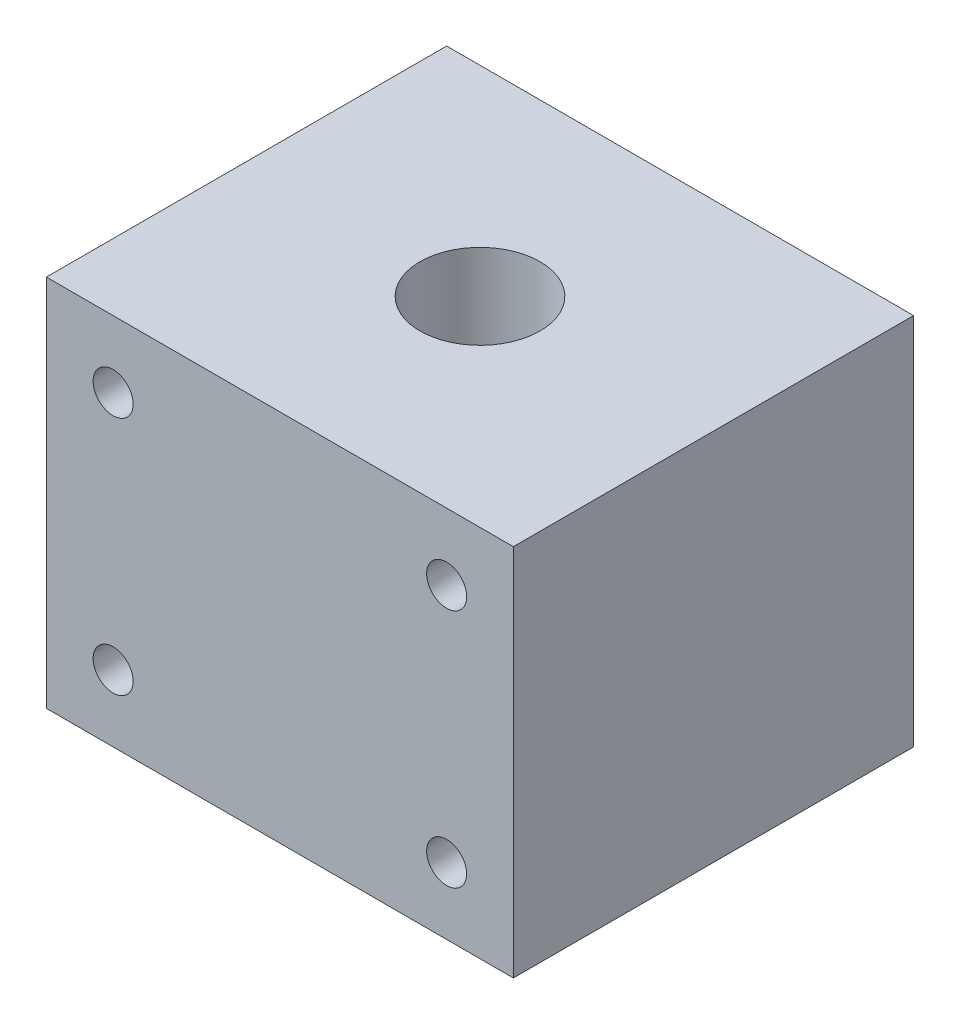
ISO-10303-21;
HEADER;
FILE_DESCRIPTION(('STEP AP214'),'2;1');
FILE_NAME('part.step','',(''),(''),'','','');
FILE_SCHEMA(('AUTOMOTIVE_DESIGN { 1 0 10303 214 1 1 1 1 }'));
ENDSEC;
DATA;
#1=APPLICATION_CONTEXT('core data for automotive mechanical design processes');
#2=APPLICATION_PROTOCOL_DEFINITION('international standard','automotive_design',2000,#1);
#3=PRODUCT_CONTEXT('',#1,'mechanical');
#4=PRODUCT('Part','Part','',(#3));
#5=PRODUCT_RELATED_PRODUCT_CATEGORY('part','',(#4));
#6=PRODUCT_DEFINITION_FORMATION('','',#4);
#7=PRODUCT_DEFINITION_CONTEXT('part definition',#1,'design');
#8=PRODUCT_DEFINITION('design','',#6,#7);
#9=PRODUCT_DEFINITION_SHAPE('','',#8);
#10=(LENGTH_UNIT() NAMED_UNIT(*) SI_UNIT(.MILLI.,.METRE.));
#11=(NAMED_UNIT(*) PLANE_ANGLE_UNIT() SI_UNIT($,.RADIAN.));
#12=(NAMED_UNIT(*) SI_UNIT($,.STERADIAN.) SOLID_ANGLE_UNIT());
#13=UNCERTAINTY_MEASURE_WITH_UNIT(LENGTH_MEASURE(1.E-05),#10,'distance_accuracy_value','');
#14=(GEOMETRIC_REPRESENTATION_CONTEXT(3) GLOBAL_UNCERTAINTY_ASSIGNED_CONTEXT((#13)) GLOBAL_UNIT_ASSIGNED_CONTEXT((#10,
#11,#12)) REPRESENTATION_CONTEXT('',''));
#15=CARTESIAN_POINT('',(0.,0.,0.));
#16=DIRECTION('',(0.,0.,1.));
#17=DIRECTION('',(1.,0.,0.));
#18=AXIS2_PLACEMENT_3D('',#15,#16,#17);
#19=CARTESIAN_POINT('',(17.5,28.,15.));
#20=DIRECTION('',(-1.,0.,0.));
#21=DIRECTION('',(0.,0.,1.));
#22=AXIS2_PLACEMENT_3D('',#19,#20,#21);
#23=PLANE('',#22);
#24=DIRECTION('',(0.,0.,-1.));
#25=VECTOR('',#24,1.);
#26=CARTESIAN_POINT('',(17.5,0.,15.));
#27=LINE('',#26,#25);
#28=CARTESIAN_POINT('',(17.5,0.,15.));
#29=VERTEX_POINT('',#28);
#30=CARTESIAN_POINT('',(17.5,0.,-15.));
#31=VERTEX_POINT('',#30);
#32=EDGE_CURVE('E102',#29,#31,#27,.T.);
#33=ORIENTED_EDGE('',*,*,#32,.T.);
#34=DIRECTION('',(0.,-1.,0.));
#35=VECTOR('',#34,1.);
#36=CARTESIAN_POINT('',(17.5,28.,-15.));
#37=LINE('',#36,#35);
#38=CARTESIAN_POINT('',(17.5,28.,-15.));
#39=VERTEX_POINT('',#38);
#40=EDGE_CURVE('E11',#39,#31,#37,.T.);
#41=ORIENTED_EDGE('',*,*,#40,.F.);
#42=DIRECTION('',(0.,0.,-1.));
#43=VECTOR('',#42,1.);
#44=CARTESIAN_POINT('',(17.5,28.,15.));
#45=LINE('',#44,#43);
#46=CARTESIAN_POINT('',(17.5,28.,15.));
#47=VERTEX_POINT('',#46);
#48=EDGE_CURVE('E89',#47,#39,#45,.T.);
#49=ORIENTED_EDGE('',*,*,#48,.F.);
#50=DIRECTION('',(0.,-1.,0.));
#51=VECTOR('',#50,1.);
#52=CARTESIAN_POINT('',(17.5,28.,15.));
#53=LINE('',#52,#51);
#54=EDGE_CURVE('E98',#47,#29,#53,.T.);
#55=ORIENTED_EDGE('',*,*,#54,.T.);
#56=EDGE_LOOP('',(#33,#41,#49,#55));
#57=FACE_BOUND('',#56,.T.);
#58=ADVANCED_FACE('F37',(#57),#23,.F.);
#59=CARTESIAN_POINT('',(-17.5,28.,-15.));
#60=DIRECTION('',(0.,0.,1.));
#61=DIRECTION('',(1.,0.,0.));
#62=AXIS2_PLACEMENT_3D('',#59,#60,#61);
#63=PLANE('',#62);
#64=DIRECTION('',(-1.,0.,0.));
#65=VECTOR('',#64,1.);
#66=CARTESIAN_POINT('',(-17.5,0.,-15.));
#67=LINE('',#66,#65);
#68=CARTESIAN_POINT('',(-17.5,0.,-15.));
#69=VERTEX_POINT('',#68);
#70=EDGE_CURVE('E93',#31,#69,#67,.T.);
#71=ORIENTED_EDGE('',*,*,#70,.T.);
#72=DIRECTION('',(0.,-1.,0.));
#73=VECTOR('',#72,1.);
#74=CARTESIAN_POINT('',(-17.5,28.,-15.));
#75=LINE('',#74,#73);
#76=CARTESIAN_POINT('',(-17.5,28.,-15.));
#77=VERTEX_POINT('',#76);
#78=EDGE_CURVE('E46',#77,#69,#75,.T.);
#79=ORIENTED_EDGE('',*,*,#78,.F.);
#80=DIRECTION('',(-1.,0.,0.));
#81=VECTOR('',#80,1.);
#82=CARTESIAN_POINT('',(-17.5,28.,-15.));
#83=LINE('',#82,#81);
#84=EDGE_CURVE('E84',#39,#77,#83,.T.);
#85=ORIENTED_EDGE('',*,*,#84,.F.);
#86=ORIENTED_EDGE('',*,*,#40,.T.);
#87=EDGE_LOOP('',(#71,#79,#85,#86));
#88=FACE_BOUND('',#87,.T.);
#89=ADVANCED_FACE('F92',(#88),#63,.F.);
#90=CARTESIAN_POINT('',(-17.5,28.,15.));
#91=DIRECTION('',(1.,0.,0.));
#92=DIRECTION('',(0.,0.,-1.));
#93=AXIS2_PLACEMENT_3D('',#90,#91,#92);
#94=PLANE('',#93);
#95=DIRECTION('',(0.,0.,1.));
#96=VECTOR('',#95,1.);
#97=CARTESIAN_POINT('',(-17.5,0.,15.));
#98=LINE('',#97,#96);
#99=CARTESIAN_POINT('',(-17.5,0.,15.));
#100=VERTEX_POINT('',#99);
#101=EDGE_CURVE('E71',#69,#100,#98,.T.);
#102=ORIENTED_EDGE('',*,*,#101,.T.);
#103=DIRECTION('',(0.,-1.,0.));
#104=VECTOR('',#103,1.);
#105=CARTESIAN_POINT('',(-17.5,28.,15.));
#106=LINE('',#105,#104);
#107=CARTESIAN_POINT('',(-17.5,28.,15.));
#108=VERTEX_POINT('',#107);
#109=EDGE_CURVE('E94',#108,#100,#106,.T.);
#110=ORIENTED_EDGE('',*,*,#109,.F.);
#111=DIRECTION('',(0.,0.,1.));
#112=VECTOR('',#111,1.);
#113=CARTESIAN_POINT('',(-17.5,28.,15.));
#114=LINE('',#113,#112);
#115=EDGE_CURVE('E87',#77,#108,#114,.T.);
#116=ORIENTED_EDGE('',*,*,#115,.F.);
#117=ORIENTED_EDGE('',*,*,#78,.T.);
#118=EDGE_LOOP('',(#102,#110,#116,#117));
#119=FACE_BOUND('',#118,.T.);
#120=ADVANCED_FACE('F96',(#119),#94,.F.);
#121=CARTESIAN_POINT('',(-17.5,28.,15.));
#122=DIRECTION('',(0.,0.,-1.));
#123=DIRECTION('',(-1.,0.,0.));
#124=AXIS2_PLACEMENT_3D('',#121,#122,#123);
#125=PLANE('',#124);
#126=CARTESIAN_POINT('',(-12.5,5.,15.));
#127=DIRECTION('',(0.,0.,1.));
#128=DIRECTION('',(1.,0.,0.));
#129=AXIS2_PLACEMENT_3D('',#126,#127,#128);
#130=CIRCLE('',#129,1.5);
#131=CARTESIAN_POINT('',(-11.,5.,15.));
#132=VERTEX_POINT('',#131);
#133=EDGE_CURVE('E122',#132,#132,#130,.T.);
#134=ORIENTED_EDGE('',*,*,#133,.F.);
#135=EDGE_LOOP('',(#134));
#136=FACE_BOUND('',#135,.T.);
#137=CARTESIAN_POINT('',(12.5,5.,15.));
#138=DIRECTION('',(0.,0.,1.));
#139=DIRECTION('',(1.,0.,0.));
#140=AXIS2_PLACEMENT_3D('',#137,#138,#139);
#141=CIRCLE('',#140,1.5);
#142=CARTESIAN_POINT('',(14.,5.,15.));
#143=VERTEX_POINT('',#142);
#144=EDGE_CURVE('E129',#143,#143,#141,.T.);
#145=ORIENTED_EDGE('',*,*,#144,.F.);
#146=EDGE_LOOP('',(#145));
#147=FACE_BOUND('',#146,.T.);
#148=CARTESIAN_POINT('',(12.5,23.,15.));
#149=DIRECTION('',(0.,0.,1.));
#150=DIRECTION('',(1.,0.,0.));
#151=AXIS2_PLACEMENT_3D('',#148,#149,#150);
#152=CIRCLE('',#151,1.5);
#153=CARTESIAN_POINT('',(14.,23.,15.));
#154=VERTEX_POINT('',#153);
#155=EDGE_CURVE('E135',#154,#154,#152,.T.);
#156=ORIENTED_EDGE('',*,*,#155,.F.);
#157=EDGE_LOOP('',(#156));
#158=FACE_BOUND('',#157,.T.);
#159=CARTESIAN_POINT('',(-12.5,23.,15.));
#160=DIRECTION('',(0.,0.,1.));
#161=DIRECTION('',(1.,0.,0.));
#162=AXIS2_PLACEMENT_3D('',#159,#160,#161);
#163=CIRCLE('',#162,1.5);
#164=CARTESIAN_POINT('',(-11.,23.,15.));
#165=VERTEX_POINT('',#164);
#166=EDGE_CURVE('E116',#165,#165,#163,.T.);
#167=ORIENTED_EDGE('',*,*,#166,.F.);
#168=EDGE_LOOP('',(#167));
#169=FACE_BOUND('',#168,.T.);
#170=DIRECTION('',(1.,0.,0.));
#171=VECTOR('',#170,1.);
#172=CARTESIAN_POINT('',(-17.5,0.,15.));
#173=LINE('',#172,#171);
#174=EDGE_CURVE('E77',#100,#29,#173,.T.);
#175=ORIENTED_EDGE('',*,*,#174,.T.);
#176=ORIENTED_EDGE('',*,*,#54,.F.);
#177=DIRECTION('',(1.,0.,0.));
#178=VECTOR('',#177,1.);
#179=CARTESIAN_POINT('',(-17.5,28.,15.));
#180=LINE('',#179,#178);
#181=EDGE_CURVE('E54',#108,#47,#180,.T.);
#182=ORIENTED_EDGE('',*,*,#181,.F.);
#183=ORIENTED_EDGE('',*,*,#109,.T.);
#184=EDGE_LOOP('',(#175,#176,#182,#183));
#185=FACE_BOUND('',#184,.T.);
#186=ADVANCED_FACE('F110',(#136,#147,#158,#169,#185),#125,.F.);
#187=CARTESIAN_POINT('',(0.,28.,0.));
#188=DIRECTION('',(0.,-1.,0.));
#189=DIRECTION('',(0.,0.,-1.));
#190=AXIS2_PLACEMENT_3D('',#187,#188,#189);
#191=PLANE('',#190);
#192=CARTESIAN_POINT('',(0.,28.,0.));
#193=DIRECTION('',(0.,-1.,0.));
#194=DIRECTION('',(0.,0.,-1.));
#195=AXIS2_PLACEMENT_3D('',#192,#193,#194);
#196=CIRCLE('',#195,4.5);
#197=CARTESIAN_POINT('',(0.,28.,-4.5));
#198=VERTEX_POINT('',#197);
#199=EDGE_CURVE('E145',#198,#198,#196,.T.);
#200=ORIENTED_EDGE('',*,*,#199,.T.);
#201=EDGE_LOOP('',(#200));
#202=FACE_BOUND('',#201,.T.);
#203=ORIENTED_EDGE('',*,*,#48,.T.);
#204=ORIENTED_EDGE('',*,*,#84,.T.);
#205=ORIENTED_EDGE('',*,*,#115,.T.);
#206=ORIENTED_EDGE('',*,*,#181,.T.);
#207=EDGE_LOOP('',(#203,#204,#205,#206));
#208=FACE_BOUND('',#207,.T.);
#209=ADVANCED_FACE('F85',(#202,#208),#191,.F.);
#210=CARTESIAN_POINT('',(0.,0.,0.));
#211=DIRECTION('',(0.,-1.,0.));
#212=DIRECTION('',(0.,0.,-1.));
#213=AXIS2_PLACEMENT_3D('',#210,#211,#212);
#214=PLANE('',#213);
#215=CARTESIAN_POINT('',(0.,0.,0.));
#216=DIRECTION('',(0.,-1.,0.));
#217=DIRECTION('',(0.,0.,-1.));
#218=AXIS2_PLACEMENT_3D('',#215,#216,#217);
#219=CIRCLE('',#218,11.5);
#220=CARTESIAN_POINT('',(0.,0.,-11.5));
#221=VERTEX_POINT('',#220);
#222=EDGE_CURVE('E140',#221,#221,#219,.T.);
#223=ORIENTED_EDGE('',*,*,#222,.F.);
#224=EDGE_LOOP('',(#223));
#225=FACE_BOUND('',#224,.T.);
#226=ORIENTED_EDGE('',*,*,#32,.F.);
#227=ORIENTED_EDGE('',*,*,#174,.F.);
#228=ORIENTED_EDGE('',*,*,#101,.F.);
#229=ORIENTED_EDGE('',*,*,#70,.F.);
#230=EDGE_LOOP('',(#226,#227,#228,#229));
#231=FACE_BOUND('',#230,.T.);
#232=ADVANCED_FACE('F113',(#225,#231),#214,.T.);
#233=CARTESIAN_POINT('',(-12.5,23.,5.));
#234=DIRECTION('',(0.,0.,1.));
#235=DIRECTION('',(1.,0.,0.));
#236=AXIS2_PLACEMENT_3D('',#233,#234,#235);
#237=CYLINDRICAL_SURFACE('',#236,1.5);
#238=CARTESIAN_POINT('',(-12.5,23.,5.));
#239=DIRECTION('',(0.,0.,1.));
#240=DIRECTION('',(1.,0.,0.));
#241=AXIS2_PLACEMENT_3D('',#238,#239,#240);
#242=CIRCLE('',#241,1.5);
#243=CARTESIAN_POINT('',(-11.,23.,5.));
#244=VERTEX_POINT('',#243);
#245=EDGE_CURVE('E105',#244,#244,#242,.T.);
#246=ORIENTED_EDGE('',*,*,#245,.F.);
#247=EDGE_LOOP('',(#246));
#248=FACE_BOUND('',#247,.T.);
#249=ORIENTED_EDGE('',*,*,#166,.T.);
#250=EDGE_LOOP('',(#249));
#251=FACE_BOUND('',#250,.T.);
#252=ADVANCED_FACE('F178',(#248,#251),#237,.F.);
#253=CARTESIAN_POINT('',(-12.5,23.,5.));
#254=DIRECTION('',(0.,0.,1.));
#255=DIRECTION('',(1.,0.,0.));
#256=AXIS2_PLACEMENT_3D('',#253,#254,#255);
#257=PLANE('',#256);
#258=ORIENTED_EDGE('',*,*,#245,.T.);
#259=EDGE_LOOP('',(#258));
#260=FACE_BOUND('',#259,.T.);
#261=ADVANCED_FACE('F184',(#260),#257,.T.);
#262=CARTESIAN_POINT('',(12.5,23.,5.));
#263=DIRECTION('',(0.,0.,1.));
#264=DIRECTION('',(1.,0.,0.));
#265=AXIS2_PLACEMENT_3D('',#262,#263,#264);
#266=CYLINDRICAL_SURFACE('',#265,1.5);
#267=CARTESIAN_POINT('',(12.5,23.,5.));
#268=DIRECTION('',(0.,0.,1.));
#269=DIRECTION('',(1.,0.,0.));
#270=AXIS2_PLACEMENT_3D('',#267,#268,#269);
#271=CIRCLE('',#270,1.5);
#272=CARTESIAN_POINT('',(14.,23.,5.));
#273=VERTEX_POINT('',#272);
#274=EDGE_CURVE('E119',#273,#273,#271,.T.);
#275=ORIENTED_EDGE('',*,*,#274,.F.);
#276=EDGE_LOOP('',(#275));
#277=FACE_BOUND('',#276,.T.);
#278=ORIENTED_EDGE('',*,*,#155,.T.);
#279=EDGE_LOOP('',(#278));
#280=FACE_BOUND('',#279,.T.);
#281=ADVANCED_FACE('F188',(#277,#280),#266,.F.);
#282=CARTESIAN_POINT('',(12.5,23.,5.));
#283=DIRECTION('',(0.,0.,1.));
#284=DIRECTION('',(1.,0.,0.));
#285=AXIS2_PLACEMENT_3D('',#282,#283,#284);
#286=PLANE('',#285);
#287=ORIENTED_EDGE('',*,*,#274,.T.);
#288=EDGE_LOOP('',(#287));
#289=FACE_BOUND('',#288,.T.);
#290=ADVANCED_FACE('F202',(#289),#286,.T.);
#291=CARTESIAN_POINT('',(12.5,5.,5.));
#292=DIRECTION('',(0.,0.,1.));
#293=DIRECTION('',(1.,0.,0.));
#294=AXIS2_PLACEMENT_3D('',#291,#292,#293);
#295=CYLINDRICAL_SURFACE('',#294,1.5);
#296=CARTESIAN_POINT('',(12.5,5.,5.));
#297=DIRECTION('',(0.,0.,1.));
#298=DIRECTION('',(1.,0.,0.));
#299=AXIS2_PLACEMENT_3D('',#296,#297,#298);
#300=CIRCLE('',#299,1.5);
#301=CARTESIAN_POINT('',(14.,5.,5.));
#302=VERTEX_POINT('',#301);
#303=EDGE_CURVE('E132',#302,#302,#300,.T.);
#304=ORIENTED_EDGE('',*,*,#303,.F.);
#305=EDGE_LOOP('',(#304));
#306=FACE_BOUND('',#305,.T.);
#307=ORIENTED_EDGE('',*,*,#144,.T.);
#308=EDGE_LOOP('',(#307));
#309=FACE_BOUND('',#308,.T.);
#310=ADVANCED_FACE('F199',(#306,#309),#295,.F.);
#311=CARTESIAN_POINT('',(12.5,5.,5.));
#312=DIRECTION('',(0.,0.,1.));
#313=DIRECTION('',(1.,0.,0.));
#314=AXIS2_PLACEMENT_3D('',#311,#312,#313);
#315=PLANE('',#314);
#316=ORIENTED_EDGE('',*,*,#303,.T.);
#317=EDGE_LOOP('',(#316));
#318=FACE_BOUND('',#317,.T.);
#319=ADVANCED_FACE('F194',(#318),#315,.T.);
#320=CARTESIAN_POINT('',(-12.5,5.,5.));
#321=DIRECTION('',(0.,0.,1.));
#322=DIRECTION('',(1.,0.,0.));
#323=AXIS2_PLACEMENT_3D('',#320,#321,#322);
#324=CYLINDRICAL_SURFACE('',#323,1.5);
#325=CARTESIAN_POINT('',(-12.5,5.,5.));
#326=DIRECTION('',(0.,0.,1.));
#327=DIRECTION('',(1.,0.,0.));
#328=AXIS2_PLACEMENT_3D('',#325,#326,#327);
#329=CIRCLE('',#328,1.5);
#330=CARTESIAN_POINT('',(-11.,5.,5.));
#331=VERTEX_POINT('',#330);
#332=EDGE_CURVE('E125',#331,#331,#329,.T.);
#333=ORIENTED_EDGE('',*,*,#332,.F.);
#334=EDGE_LOOP('',(#333));
#335=FACE_BOUND('',#334,.T.);
#336=ORIENTED_EDGE('',*,*,#133,.T.);
#337=EDGE_LOOP('',(#336));
#338=FACE_BOUND('',#337,.T.);
#339=ADVANCED_FACE('F190',(#335,#338),#324,.F.);
#340=CARTESIAN_POINT('',(-12.5,5.,5.));
#341=DIRECTION('',(0.,0.,1.));
#342=DIRECTION('',(1.,0.,0.));
#343=AXIS2_PLACEMENT_3D('',#340,#341,#342);
#344=PLANE('',#343);
#345=ORIENTED_EDGE('',*,*,#332,.T.);
#346=EDGE_LOOP('',(#345));
#347=FACE_BOUND('',#346,.T.);
#348=ADVANCED_FACE('F193',(#347),#344,.T.);
#349=CARTESIAN_POINT('',(0.,3.,0.));
#350=DIRECTION('',(0.,-1.,0.));
#351=DIRECTION('',(0.,0.,-1.));
#352=AXIS2_PLACEMENT_3D('',#349,#350,#351);
#353=CYLINDRICAL_SURFACE('',#352,11.5);
#354=CARTESIAN_POINT('',(0.,3.,0.));
#355=DIRECTION('',(0.,-1.,0.));
#356=DIRECTION('',(0.,0.,-1.));
#357=AXIS2_PLACEMENT_3D('',#354,#355,#356);
#358=CIRCLE('',#357,11.5);
#359=CARTESIAN_POINT('',(0.,3.,-11.5));
#360=VERTEX_POINT('',#359);
#361=EDGE_CURVE('E126',#360,#360,#358,.T.);
#362=ORIENTED_EDGE('',*,*,#361,.F.);
#363=EDGE_LOOP('',(#362));
#364=FACE_BOUND('',#363,.T.);
#365=ORIENTED_EDGE('',*,*,#222,.T.);
#366=EDGE_LOOP('',(#365));
#367=FACE_BOUND('',#366,.T.);
#368=ADVANCED_FACE('F162',(#364,#367),#353,.F.);
#369=CARTESIAN_POINT('',(0.,3.,0.));
#370=DIRECTION('',(0.,-1.,0.));
#371=DIRECTION('',(0.,0.,-1.));
#372=AXIS2_PLACEMENT_3D('',#369,#370,#371);
#373=PLANE('',#372);
#374=CARTESIAN_POINT('',(0.,3.,0.));
#375=DIRECTION('',(0.,-1.,0.));
#376=DIRECTION('',(0.,0.,-1.));
#377=AXIS2_PLACEMENT_3D('',#374,#375,#376);
#378=CIRCLE('',#377,4.5);
#379=CARTESIAN_POINT('',(0.,3.,-4.5));
#380=VERTEX_POINT('',#379);
#381=EDGE_CURVE('E40',#380,#380,#378,.F.);
#382=ORIENTED_EDGE('',*,*,#381,.T.);
#383=EDGE_LOOP('',(#382));
#384=FACE_BOUND('',#383,.T.);
#385=ORIENTED_EDGE('',*,*,#361,.T.);
#386=EDGE_LOOP('',(#385));
#387=FACE_BOUND('',#386,.T.);
#388=ADVANCED_FACE('F152',(#384,#387),#373,.T.);
#389=CARTESIAN_POINT('',(0.,0.,0.));
#390=DIRECTION('',(0.,1.,0.));
#391=DIRECTION('',(0.,0.,1.));
#392=AXIS2_PLACEMENT_3D('',#389,#390,#391);
#393=CYLINDRICAL_SURFACE('',#392,4.5);
#394=ORIENTED_EDGE('',*,*,#381,.F.);
#395=EDGE_LOOP('',(#394));
#396=FACE_BOUND('',#395,.T.);
#397=ORIENTED_EDGE('',*,*,#199,.F.);
#398=EDGE_LOOP('',(#397));
#399=FACE_BOUND('',#398,.T.);
#400=ADVANCED_FACE('F155',(#396,#399),#393,.F.);
#401=CLOSED_SHELL('',(#58,#89,#120,#186,#209,#232,#252,#261,#281,#290,#310,#319,#339,#348,#368,
#388,#400));
#402=MANIFOLD_SOLID_BREP('B2',#401);
#403=ADVANCED_BREP_SHAPE_REPRESENTATION('',(#18,#402),#14);
#404=SHAPE_DEFINITION_REPRESENTATION(#9,#403);
ENDSEC;
END-ISO-10303-21;
